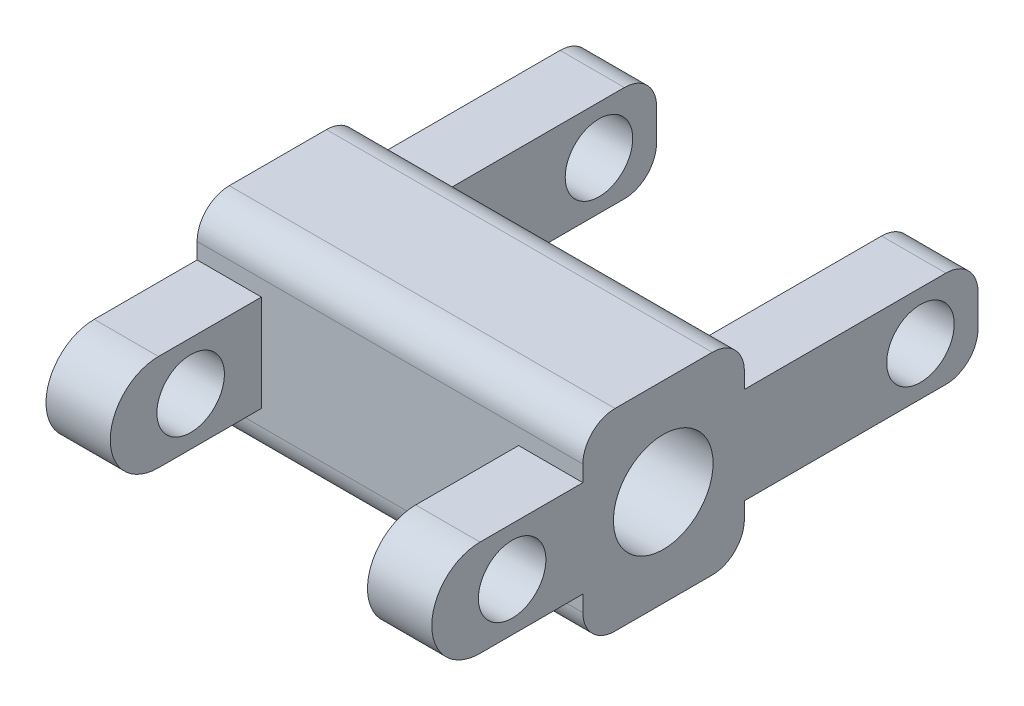
ISO-10303-21;
HEADER;
FILE_DESCRIPTION(('STEP AP214'),'2;1');
FILE_NAME('part.step','',(''),(''),'','','');
FILE_SCHEMA(('AUTOMOTIVE_DESIGN { 1 0 10303 214 1 1 1 1 }'));
ENDSEC;
DATA;
#1=APPLICATION_CONTEXT('core data for automotive mechanical design processes');
#2=APPLICATION_PROTOCOL_DEFINITION('international standard','automotive_design',2000,#1);
#3=PRODUCT_CONTEXT('',#1,'mechanical');
#4=PRODUCT('Part','Part','',(#3));
#5=PRODUCT_RELATED_PRODUCT_CATEGORY('part','',(#4));
#6=PRODUCT_DEFINITION_FORMATION('','',#4);
#7=PRODUCT_DEFINITION_CONTEXT('part definition',#1,'design');
#8=PRODUCT_DEFINITION('design','',#6,#7);
#9=PRODUCT_DEFINITION_SHAPE('','',#8);
#10=(LENGTH_UNIT() NAMED_UNIT(*) SI_UNIT(.MILLI.,.METRE.));
#11=(NAMED_UNIT(*) PLANE_ANGLE_UNIT() SI_UNIT($,.RADIAN.));
#12=(NAMED_UNIT(*) SI_UNIT($,.STERADIAN.) SOLID_ANGLE_UNIT());
#13=UNCERTAINTY_MEASURE_WITH_UNIT(LENGTH_MEASURE(1.E-05),#10,'distance_accuracy_value','');
#14=(GEOMETRIC_REPRESENTATION_CONTEXT(3) GLOBAL_UNCERTAINTY_ASSIGNED_CONTEXT((#13)) GLOBAL_UNIT_ASSIGNED_CONTEXT((#10,
#11,#12)) REPRESENTATION_CONTEXT('',''));
#15=CARTESIAN_POINT('',(0.,0.,0.));
#16=DIRECTION('',(0.,0.,1.));
#17=DIRECTION('',(1.,0.,0.));
#18=AXIS2_PLACEMENT_3D('',#15,#16,#17);
#19=CARTESIAN_POINT('',(0.,3.,0.));
#20=DIRECTION('',(0.,-1.,0.));
#21=DIRECTION('',(0.,0.,-1.));
#22=AXIS2_PLACEMENT_3D('',#19,#20,#21);
#23=PLANE('',#22);
#24=DIRECTION('',(1.,0.,0.));
#25=VECTOR('',#24,1.);
#26=CARTESIAN_POINT('',(-4.,3.,-2.77831175574415));
#27=LINE('',#26,#25);
#28=CARTESIAN_POINT('',(-4.,3.,-2.77831175574415));
#29=VERTEX_POINT('',#28);
#30=CARTESIAN_POINT('',(4.,3.,-2.77831175574415));
#31=VERTEX_POINT('',#30);
#32=EDGE_CURVE('E239',#29,#31,#27,.T.);
#33=ORIENTED_EDGE('',*,*,#32,.F.);
#34=DIRECTION('',(0.,0.,1.));
#35=VECTOR('',#34,1.);
#36=CARTESIAN_POINT('',(-4.,3.,-12.));
#37=LINE('',#36,#35);
#38=CARTESIAN_POINT('',(-4.,3.,-8.29020961255298));
#39=VERTEX_POINT('',#38);
#40=EDGE_CURVE('E222',#39,#29,#37,.T.);
#41=ORIENTED_EDGE('',*,*,#40,.F.);
#42=DIRECTION('',(1.,0.,0.));
#43=VECTOR('',#42,1.);
#44=CARTESIAN_POINT('',(0.,3.,-8.29020961255298));
#45=LINE('',#44,#43);
#46=CARTESIAN_POINT('',(-6.,3.,-8.29020961255298));
#47=VERTEX_POINT('',#46);
#48=EDGE_CURVE('E435',#39,#47,#45,.F.);
#49=ORIENTED_EDGE('',*,*,#48,.T.);
#50=DIRECTION('',(0.,0.,1.));
#51=VECTOR('',#50,1.);
#52=CARTESIAN_POINT('',(-6.,3.,0.));
#53=LINE('',#52,#51);
#54=CARTESIAN_POINT('',(-6.,3.,-2.02360737876782));
#55=VERTEX_POINT('',#54);
#56=EDGE_CURVE('E345',#47,#55,#53,.T.);
#57=ORIENTED_EDGE('',*,*,#56,.T.);
#58=DIRECTION('',(1.,0.,0.));
#59=VECTOR('',#58,1.);
#60=CARTESIAN_POINT('',(0.,3.,-2.02360737876782));
#61=LINE('',#60,#59);
#62=CARTESIAN_POINT('',(6.,3.,-2.02360737876782));
#63=VERTEX_POINT('',#62);
#64=EDGE_CURVE('E233',#55,#63,#61,.T.);
#65=ORIENTED_EDGE('',*,*,#64,.T.);
#66=DIRECTION('',(0.,0.,-1.));
#67=VECTOR('',#66,1.);
#68=CARTESIAN_POINT('',(6.,3.,8.7));
#69=LINE('',#68,#67);
#70=CARTESIAN_POINT('',(6.,3.,-8.29020961255298));
#71=VERTEX_POINT('',#70);
#72=EDGE_CURVE('E340',#63,#71,#69,.T.);
#73=ORIENTED_EDGE('',*,*,#72,.T.);
#74=DIRECTION('',(1.,0.,0.));
#75=VECTOR('',#74,1.);
#76=CARTESIAN_POINT('',(0.,3.,-8.29020961255298));
#77=LINE('',#76,#75);
#78=CARTESIAN_POINT('',(4.,3.,-8.29020961255298));
#79=VERTEX_POINT('',#78);
#80=EDGE_CURVE('E433',#71,#79,#77,.F.);
#81=ORIENTED_EDGE('',*,*,#80,.T.);
#82=DIRECTION('',(0.,0.,-1.));
#83=VECTOR('',#82,1.);
#84=CARTESIAN_POINT('',(4.,3.,-12.));
#85=LINE('',#84,#83);
#86=EDGE_CURVE('E232',#31,#79,#85,.T.);
#87=ORIENTED_EDGE('',*,*,#86,.F.);
#88=EDGE_LOOP('',(#33,#41,#49,#57,#65,#73,#81,#87));
#89=FACE_BOUND('',#88,.T.);
#90=ADVANCED_FACE('F35',(#89),#23,.F.);
#91=CARTESIAN_POINT('',(6.00000000000001,3.,6.2));
#92=VERTEX_POINT('',#91);
#93=CARTESIAN_POINT('',(6.,3.,3.));
#94=VERTEX_POINT('',#93);
#95=EDGE_CURVE('E341',#92,#94,#69,.T.);
#96=ORIENTED_EDGE('',*,*,#95,.T.);
#97=DIRECTION('',(-1.,0.,0.));
#98=VECTOR('',#97,1.);
#99=CARTESIAN_POINT('',(0.,3.,3.));
#100=LINE('',#99,#98);
#101=CARTESIAN_POINT('',(4.,3.,3.));
#102=VERTEX_POINT('',#101);
#103=EDGE_CURVE('E288',#94,#102,#100,.T.);
#104=ORIENTED_EDGE('',*,*,#103,.T.);
#105=DIRECTION('',(0.,0.,1.));
#106=VECTOR('',#105,1.);
#107=CARTESIAN_POINT('',(4.,3.,3.));
#108=LINE('',#107,#106);
#109=CARTESIAN_POINT('',(4.,3.,6.2));
#110=VERTEX_POINT('',#109);
#111=EDGE_CURVE('E336',#102,#110,#108,.T.);
#112=ORIENTED_EDGE('',*,*,#111,.T.);
#113=DIRECTION('',(-1.,0.,0.));
#114=VECTOR('',#113,1.);
#115=CARTESIAN_POINT('',(6.00000000000001,3.,6.2));
#116=LINE('',#115,#114);
#117=EDGE_CURVE('E327',#92,#110,#116,.T.);
#118=ORIENTED_EDGE('',*,*,#117,.F.);
#119=EDGE_LOOP('',(#96,#104,#112,#118));
#120=FACE_BOUND('',#119,.T.);
#121=ADVANCED_FACE('F528',(#120),#23,.F.);
#122=CARTESIAN_POINT('',(0.,0.,0.));
#123=DIRECTION('',(0.,-1.,0.));
#124=DIRECTION('',(0.,0.,-1.));
#125=AXIS2_PLACEMENT_3D('',#122,#123,#124);
#126=PLANE('',#125);
#127=DIRECTION('',(0.,0.,1.));
#128=VECTOR('',#127,1.);
#129=CARTESIAN_POINT('',(-4.,0.,-12.));
#130=LINE('',#129,#128);
#131=CARTESIAN_POINT('',(-4.,0.,-8.29020961255298));
#132=VERTEX_POINT('',#131);
#133=CARTESIAN_POINT('',(-4.,0.,-2.77831175574415));
#134=VERTEX_POINT('',#133);
#135=EDGE_CURVE('E297',#132,#134,#130,.T.);
#136=ORIENTED_EDGE('',*,*,#135,.T.);
#137=DIRECTION('',(-1.,0.,0.));
#138=VECTOR('',#137,1.);
#139=CARTESIAN_POINT('',(0.,0.,-2.77831175574415));
#140=LINE('',#139,#138);
#141=CARTESIAN_POINT('',(4.,0.,-2.77831175574415));
#142=VERTEX_POINT('',#141);
#143=EDGE_CURVE('E12',#142,#134,#140,.T.);
#144=ORIENTED_EDGE('',*,*,#143,.F.);
#145=DIRECTION('',(0.,0.,-1.));
#146=VECTOR('',#145,1.);
#147=CARTESIAN_POINT('',(4.,0.,-12.));
#148=LINE('',#147,#146);
#149=CARTESIAN_POINT('',(4.,0.,-8.29020961255298));
#150=VERTEX_POINT('',#149);
#151=EDGE_CURVE('E293',#142,#150,#148,.T.);
#152=ORIENTED_EDGE('',*,*,#151,.T.);
#153=DIRECTION('',(1.,0.,0.));
#154=VECTOR('',#153,1.);
#155=CARTESIAN_POINT('',(6.,0.,-8.29020961255298));
#156=LINE('',#155,#154);
#157=CARTESIAN_POINT('',(6.,0.,-8.29020961255298));
#158=VERTEX_POINT('',#157);
#159=EDGE_CURVE('E415',#150,#158,#156,.T.);
#160=ORIENTED_EDGE('',*,*,#159,.T.);
#161=DIRECTION('',(0.,0.,-1.));
#162=VECTOR('',#161,1.);
#163=CARTESIAN_POINT('',(6.,0.,8.7));
#164=LINE('',#163,#162);
#165=CARTESIAN_POINT('',(6.,0.,-2.02360737876782));
#166=VERTEX_POINT('',#165);
#167=EDGE_CURVE('E353',#166,#158,#164,.T.);
#168=ORIENTED_EDGE('',*,*,#167,.F.);
#169=DIRECTION('',(1.,0.,0.));
#170=VECTOR('',#169,1.);
#171=CARTESIAN_POINT('',(0.,0.,-2.02360737876782));
#172=LINE('',#171,#170);
#173=CARTESIAN_POINT('',(-6.,0.,-2.02360737876782));
#174=VERTEX_POINT('',#173);
#175=EDGE_CURVE('E374',#174,#166,#172,.T.);
#176=ORIENTED_EDGE('',*,*,#175,.F.);
#177=DIRECTION('',(0.,0.,1.));
#178=VECTOR('',#177,1.);
#179=CARTESIAN_POINT('',(-6.,0.,0.));
#180=LINE('',#179,#178);
#181=CARTESIAN_POINT('',(-6.,0.,-8.29020961255298));
#182=VERTEX_POINT('',#181);
#183=EDGE_CURVE('E337',#182,#174,#180,.T.);
#184=ORIENTED_EDGE('',*,*,#183,.F.);
#185=DIRECTION('',(1.,0.,0.));
#186=VECTOR('',#185,1.);
#187=CARTESIAN_POINT('',(-4.,0.,-8.29020961255298));
#188=LINE('',#187,#186);
#189=EDGE_CURVE('E418',#182,#132,#188,.T.);
#190=ORIENTED_EDGE('',*,*,#189,.T.);
#191=EDGE_LOOP('',(#136,#144,#152,#160,#168,#176,#184,#190));
#192=FACE_BOUND('',#191,.T.);
#193=ADVANCED_FACE('F450',(#192),#126,.T.);
#194=DIRECTION('',(-1.,0.,0.));
#195=VECTOR('',#194,1.);
#196=CARTESIAN_POINT('',(0.,0.,3.));
#197=LINE('',#196,#195);
#198=CARTESIAN_POINT('',(6.,0.,3.));
#199=VERTEX_POINT('',#198);
#200=CARTESIAN_POINT('',(4.,0.,3.));
#201=VERTEX_POINT('',#200);
#202=EDGE_CURVE('E373',#199,#201,#197,.T.);
#203=ORIENTED_EDGE('',*,*,#202,.F.);
#204=CARTESIAN_POINT('',(6.00000000000001,0.,6.2));
#205=VERTEX_POINT('',#204);
#206=EDGE_CURVE('E354',#205,#199,#164,.T.);
#207=ORIENTED_EDGE('',*,*,#206,.F.);
#208=DIRECTION('',(-1.,0.,0.));
#209=VECTOR('',#208,1.);
#210=CARTESIAN_POINT('',(6.00000000000001,0.,6.2));
#211=LINE('',#210,#209);
#212=CARTESIAN_POINT('',(4.,0.,6.2));
#213=VERTEX_POINT('',#212);
#214=EDGE_CURVE('E323',#205,#213,#211,.T.);
#215=ORIENTED_EDGE('',*,*,#214,.T.);
#216=DIRECTION('',(0.,0.,1.));
#217=VECTOR('',#216,1.);
#218=CARTESIAN_POINT('',(4.,0.,3.));
#219=LINE('',#218,#217);
#220=EDGE_CURVE('E350',#201,#213,#219,.T.);
#221=ORIENTED_EDGE('',*,*,#220,.F.);
#222=EDGE_LOOP('',(#203,#207,#215,#221));
#223=FACE_BOUND('',#222,.T.);
#224=ADVANCED_FACE('F539',(#223),#126,.T.);
#225=CARTESIAN_POINT('',(-4.,3.,8.7));
#226=DIRECTION('',(-1.,0.,0.));
#227=DIRECTION('',(0.,0.,1.));
#228=AXIS2_PLACEMENT_3D('',#225,#226,#227);
#229=PLANE('',#228);
#230=CARTESIAN_POINT('',(-4.,1.5,5.2));
#231=DIRECTION('',(-1.,0.,0.));
#232=DIRECTION('',(0.,0.,1.));
#233=AXIS2_PLACEMENT_3D('',#230,#231,#232);
#234=CIRCLE('',#233,1.05);
#235=CARTESIAN_POINT('',(-4.,1.5,6.25));
#236=VERTEX_POINT('',#235);
#237=EDGE_CURVE('E314',#236,#236,#234,.T.);
#238=ORIENTED_EDGE('',*,*,#237,.T.);
#239=EDGE_LOOP('',(#238));
#240=FACE_BOUND('',#239,.T.);
#241=CARTESIAN_POINT('',(-4.,1.5,6.2));
#242=DIRECTION('',(-1.,0.,0.));
#243=DIRECTION('',(0.,0.,1.));
#244=AXIS2_PLACEMENT_3D('',#241,#242,#243);
#245=CIRCLE('',#244,1.5);
#246=CARTESIAN_POINT('',(-4.,0.,6.2));
#247=VERTEX_POINT('',#246);
#248=CARTESIAN_POINT('',(-4.,3.,6.2));
#249=VERTEX_POINT('',#248);
#250=EDGE_CURVE('E330',#247,#249,#245,.T.);
#251=ORIENTED_EDGE('',*,*,#250,.F.);
#252=DIRECTION('',(0.,0.,-1.));
#253=VECTOR('',#252,1.);
#254=CARTESIAN_POINT('',(-4.,0.,8.7));
#255=LINE('',#254,#253);
#256=CARTESIAN_POINT('',(-4.,0.,3.));
#257=VERTEX_POINT('',#256);
#258=EDGE_CURVE('E332',#247,#257,#255,.T.);
#259=ORIENTED_EDGE('',*,*,#258,.T.);
#260=DIRECTION('',(0.,-1.,0.));
#261=VECTOR('',#260,1.);
#262=CARTESIAN_POINT('',(-4.,3.,3.));
#263=LINE('',#262,#261);
#264=CARTESIAN_POINT('',(-4.,3.,3.));
#265=VERTEX_POINT('',#264);
#266=EDGE_CURVE('E360',#265,#257,#263,.T.);
#267=ORIENTED_EDGE('',*,*,#266,.F.);
#268=DIRECTION('',(0.,0.,-1.));
#269=VECTOR('',#268,1.);
#270=CARTESIAN_POINT('',(-4.,3.,8.7));
#271=LINE('',#270,#269);
#272=EDGE_CURVE('E333',#249,#265,#271,.T.);
#273=ORIENTED_EDGE('',*,*,#272,.F.);
#274=EDGE_LOOP('',(#251,#259,#267,#273));
#275=FACE_BOUND('',#274,.T.);
#276=ADVANCED_FACE('F505',(#240,#275),#229,.F.);
#277=CARTESIAN_POINT('',(4.,3.,3.));
#278=DIRECTION('',(1.,0.,0.));
#279=DIRECTION('',(0.,0.,-1.));
#280=AXIS2_PLACEMENT_3D('',#277,#278,#279);
#281=PLANE('',#280);
#282=CARTESIAN_POINT('',(4.,1.5,5.2));
#283=DIRECTION('',(1.,0.,0.));
#284=DIRECTION('',(0.,0.,-1.));
#285=AXIS2_PLACEMENT_3D('',#282,#283,#284);
#286=CIRCLE('',#285,1.05);
#287=CARTESIAN_POINT('',(4.,1.5,4.15));
#288=VERTEX_POINT('',#287);
#289=EDGE_CURVE('E309',#288,#288,#286,.T.);
#290=ORIENTED_EDGE('',*,*,#289,.T.);
#291=EDGE_LOOP('',(#290));
#292=FACE_BOUND('',#291,.T.);
#293=CARTESIAN_POINT('',(4.,1.5,6.2));
#294=DIRECTION('',(1.,0.,0.));
#295=DIRECTION('',(0.,0.,-1.));
#296=AXIS2_PLACEMENT_3D('',#293,#294,#295);
#297=CIRCLE('',#296,1.5);
#298=EDGE_CURVE('E326',#110,#213,#297,.T.);
#299=ORIENTED_EDGE('',*,*,#298,.F.);
#300=ORIENTED_EDGE('',*,*,#111,.F.);
#301=DIRECTION('',(0.,-1.,0.));
#302=VECTOR('',#301,1.);
#303=CARTESIAN_POINT('',(4.,3.,3.));
#304=LINE('',#303,#302);
#305=EDGE_CURVE('E347',#102,#201,#304,.T.);
#306=ORIENTED_EDGE('',*,*,#305,.T.);
#307=ORIENTED_EDGE('',*,*,#220,.T.);
#308=EDGE_LOOP('',(#299,#300,#306,#307));
#309=FACE_BOUND('',#308,.T.);
#310=ADVANCED_FACE('F545',(#292,#309),#281,.F.);
#311=CARTESIAN_POINT('',(6.,3.,8.7));
#312=DIRECTION('',(-1.,0.,0.));
#313=DIRECTION('',(0.,0.,1.));
#314=AXIS2_PLACEMENT_3D('',#311,#312,#313);
#315=PLANE('',#314);
#316=CARTESIAN_POINT('',(6.,1.5,0.499999999999997));
#317=DIRECTION('',(1.,0.,0.));
#318=DIRECTION('',(0.,0.,-1.));
#319=AXIS2_PLACEMENT_3D('',#316,#317,#318);
#320=CIRCLE('',#319,1.55);
#321=CARTESIAN_POINT('',(6.,1.5,-1.05));
#322=VERTEX_POINT('',#321);
#323=EDGE_CURVE('E254',#322,#322,#320,.T.);
#324=ORIENTED_EDGE('',*,*,#323,.F.);
#325=EDGE_LOOP('',(#324));
#326=FACE_BOUND('',#325,.T.);
#327=CARTESIAN_POINT('',(6.,1.5,5.2));
#328=DIRECTION('',(-1.,0.,0.));
#329=DIRECTION('',(0.,0.,1.));
#330=AXIS2_PLACEMENT_3D('',#327,#328,#329);
#331=CIRCLE('',#330,1.05);
#332=CARTESIAN_POINT('',(6.,1.5,6.25));
#333=VERTEX_POINT('',#332);
#334=EDGE_CURVE('E306',#333,#333,#331,.T.);
#335=ORIENTED_EDGE('',*,*,#334,.T.);
#336=EDGE_LOOP('',(#335));
#337=FACE_BOUND('',#336,.T.);
#338=ORIENTED_EDGE('',*,*,#167,.T.);
#339=CARTESIAN_POINT('',(6.,1.,-8.29020961255298));
#340=DIRECTION('',(-1.,0.,0.));
#341=DIRECTION('',(0.,0.,1.));
#342=AXIS2_PLACEMENT_3D('',#339,#340,#341);
#343=CIRCLE('',#342,1.);
#344=CARTESIAN_POINT('',(6.,1.,-9.29020961255298));
#345=VERTEX_POINT('',#344);
#346=EDGE_CURVE('E439',#158,#345,#343,.F.);
#347=ORIENTED_EDGE('',*,*,#346,.T.);
#348=DIRECTION('',(0.,-1.,0.));
#349=VECTOR('',#348,1.);
#350=CARTESIAN_POINT('',(6.,3.,-9.29020961255298));
#351=LINE('',#350,#349);
#352=CARTESIAN_POINT('',(6.,2.,-9.29020961255298));
#353=VERTEX_POINT('',#352);
#354=EDGE_CURVE('E246',#353,#345,#351,.T.);
#355=ORIENTED_EDGE('',*,*,#354,.F.);
#356=CARTESIAN_POINT('',(6.,2.,-8.29020961255298));
#357=DIRECTION('',(-1.,0.,0.));
#358=DIRECTION('',(0.,0.,1.));
#359=AXIS2_PLACEMENT_3D('',#356,#357,#358);
#360=CIRCLE('',#359,1.);
#361=EDGE_CURVE('E437',#353,#71,#360,.F.);
#362=ORIENTED_EDGE('',*,*,#361,.T.);
#363=ORIENTED_EDGE('',*,*,#72,.F.);
#364=DIRECTION('',(0.,1.,0.));
#365=VECTOR('',#364,1.);
#366=CARTESIAN_POINT('',(6.,-1.5,-2.02360737876782));
#367=LINE('',#366,#365);
#368=CARTESIAN_POINT('',(6.,3.5,-2.02360737876782));
#369=VERTEX_POINT('',#368);
#370=EDGE_CURVE('E280',#63,#369,#367,.T.);
#371=ORIENTED_EDGE('',*,*,#370,.T.);
#372=CARTESIAN_POINT('',(6.,3.5,-1.02360737876782));
#373=DIRECTION('',(-1.,0.,0.));
#374=DIRECTION('',(0.,0.,1.));
#375=AXIS2_PLACEMENT_3D('',#372,#373,#374);
#376=CIRCLE('',#375,1.);
#377=CARTESIAN_POINT('',(6.,4.5,-1.02360737876782));
#378=VERTEX_POINT('',#377);
#379=EDGE_CURVE('E399',#369,#378,#376,.F.);
#380=ORIENTED_EDGE('',*,*,#379,.T.);
#381=DIRECTION('',(0.,0.,-1.));
#382=VECTOR('',#381,1.);
#383=CARTESIAN_POINT('',(6.,4.5,3.));
#384=LINE('',#383,#382);
#385=CARTESIAN_POINT('',(6.,4.5,2.));
#386=VERTEX_POINT('',#385);
#387=EDGE_CURVE('E265',#386,#378,#384,.T.);
#388=ORIENTED_EDGE('',*,*,#387,.F.);
#389=CARTESIAN_POINT('',(6.,3.5,2.));
#390=DIRECTION('',(-1.,0.,0.));
#391=DIRECTION('',(0.,0.,1.));
#392=AXIS2_PLACEMENT_3D('',#389,#390,#391);
#393=CIRCLE('',#392,1.);
#394=CARTESIAN_POINT('',(6.,3.5,3.));
#395=VERTEX_POINT('',#394);
#396=EDGE_CURVE('E397',#386,#395,#393,.F.);
#397=ORIENTED_EDGE('',*,*,#396,.T.);
#398=DIRECTION('',(0.,1.,0.));
#399=VECTOR('',#398,1.);
#400=CARTESIAN_POINT('',(6.,-1.5,3.));
#401=LINE('',#400,#399);
#402=EDGE_CURVE('E283',#94,#395,#401,.T.);
#403=ORIENTED_EDGE('',*,*,#402,.F.);
#404=ORIENTED_EDGE('',*,*,#95,.F.);
#405=CARTESIAN_POINT('',(6.00000000000001,1.5,6.2));
#406=DIRECTION('',(-1.,0.,0.));
#407=DIRECTION('',(0.,0.,1.));
#408=AXIS2_PLACEMENT_3D('',#405,#406,#407);
#409=CIRCLE('',#408,1.5);
#410=EDGE_CURVE('E318',#205,#92,#409,.T.);
#411=ORIENTED_EDGE('',*,*,#410,.F.);
#412=ORIENTED_EDGE('',*,*,#206,.T.);
#413=CARTESIAN_POINT('',(6.,-0.5,3.));
#414=VERTEX_POINT('',#413);
#415=EDGE_CURVE('E281',#414,#199,#401,.T.);
#416=ORIENTED_EDGE('',*,*,#415,.F.);
#417=CARTESIAN_POINT('',(6.,-0.5,2.));
#418=DIRECTION('',(-1.,0.,0.));
#419=DIRECTION('',(0.,0.,1.));
#420=AXIS2_PLACEMENT_3D('',#417,#418,#419);
#421=CIRCLE('',#420,1.);
#422=CARTESIAN_POINT('',(6.,-1.5,2.));
#423=VERTEX_POINT('',#422);
#424=EDGE_CURVE('E395',#414,#423,#421,.F.);
#425=ORIENTED_EDGE('',*,*,#424,.T.);
#426=DIRECTION('',(0.,0.,-1.));
#427=VECTOR('',#426,1.);
#428=CARTESIAN_POINT('',(6.,-1.5,3.));
#429=LINE('',#428,#427);
#430=CARTESIAN_POINT('',(6.,-1.5,-1.02360737876782));
#431=VERTEX_POINT('',#430);
#432=EDGE_CURVE('E264',#423,#431,#429,.T.);
#433=ORIENTED_EDGE('',*,*,#432,.T.);
#434=CARTESIAN_POINT('',(6.,-0.5,-1.02360737876782));
#435=DIRECTION('',(-1.,0.,0.));
#436=DIRECTION('',(0.,0.,1.));
#437=AXIS2_PLACEMENT_3D('',#434,#435,#436);
#438=CIRCLE('',#437,1.);
#439=CARTESIAN_POINT('',(6.,-0.5,-2.02360737876782));
#440=VERTEX_POINT('',#439);
#441=EDGE_CURVE('E393',#431,#440,#438,.F.);
#442=ORIENTED_EDGE('',*,*,#441,.T.);
#443=EDGE_CURVE('E278',#440,#166,#367,.T.);
#444=ORIENTED_EDGE('',*,*,#443,.T.);
#445=EDGE_LOOP('',(#338,#347,#355,#362,#363,#371,#380,#388,#397,#403,#404,#411,#412,#416,#425,
#433,#442,#444));
#446=FACE_BOUND('',#445,.T.);
#447=CARTESIAN_POINT('',(6.,1.5,-7.5));
#448=DIRECTION('',(1.,0.,0.));
#449=DIRECTION('',(0.,0.,-1.));
#450=AXIS2_PLACEMENT_3D('',#447,#448,#449);
#451=CIRCLE('',#450,1.05);
#452=CARTESIAN_POINT('',(6.,1.5,-8.55));
#453=VERTEX_POINT('',#452);
#454=EDGE_CURVE('E299',#453,#453,#451,.T.);
#455=ORIENTED_EDGE('',*,*,#454,.F.);
#456=EDGE_LOOP('',(#455));
#457=FACE_BOUND('',#456,.T.);
#458=ADVANCED_FACE('F456',(#326,#337,#446,#457),#315,.F.);
#459=CARTESIAN_POINT('',(-6.,3.,0.));
#460=DIRECTION('',(1.,0.,0.));
#461=DIRECTION('',(0.,0.,-1.));
#462=AXIS2_PLACEMENT_3D('',#459,#460,#461);
#463=PLANE('',#462);
#464=CARTESIAN_POINT('',(-6.00000000000001,1.5,0.499999999999999));
#465=DIRECTION('',(1.,0.,0.));
#466=DIRECTION('',(0.,0.,-1.));
#467=AXIS2_PLACEMENT_3D('',#464,#465,#466);
#468=CIRCLE('',#467,1.55);
#469=CARTESIAN_POINT('',(-6.00000000000001,1.5,-1.05));
#470=VERTEX_POINT('',#469);
#471=EDGE_CURVE('E255',#470,#470,#468,.T.);
#472=ORIENTED_EDGE('',*,*,#471,.T.);
#473=EDGE_LOOP('',(#472));
#474=FACE_BOUND('',#473,.T.);
#475=CARTESIAN_POINT('',(-6.,1.5,5.2));
#476=DIRECTION('',(-1.,0.,0.));
#477=DIRECTION('',(0.,0.,1.));
#478=AXIS2_PLACEMENT_3D('',#475,#476,#477);
#479=CIRCLE('',#478,1.05);
#480=CARTESIAN_POINT('',(-6.,1.5,6.25));
#481=VERTEX_POINT('',#480);
#482=EDGE_CURVE('E303',#481,#481,#479,.T.);
#483=ORIENTED_EDGE('',*,*,#482,.F.);
#484=EDGE_LOOP('',(#483));
#485=FACE_BOUND('',#484,.T.);
#486=DIRECTION('',(0.,-1.,0.));
#487=VECTOR('',#486,1.);
#488=CARTESIAN_POINT('',(-6.00000000000001,3.,-9.29020961255298));
#489=LINE('',#488,#487);
#490=CARTESIAN_POINT('',(-6.00000000000001,2.,-9.29020961255298));
#491=VERTEX_POINT('',#490);
#492=CARTESIAN_POINT('',(-6.00000000000001,1.,-9.29020961255298));
#493=VERTEX_POINT('',#492);
#494=EDGE_CURVE('E248',#491,#493,#489,.T.);
#495=ORIENTED_EDGE('',*,*,#494,.T.);
#496=CARTESIAN_POINT('',(-6.,1.,-8.29020961255298));
#497=DIRECTION('',(1.,0.,0.));
#498=DIRECTION('',(0.,0.,-1.));
#499=AXIS2_PLACEMENT_3D('',#496,#497,#498);
#500=CIRCLE('',#499,1.);
#501=EDGE_CURVE('E431',#493,#182,#500,.F.);
#502=ORIENTED_EDGE('',*,*,#501,.T.);
#503=ORIENTED_EDGE('',*,*,#183,.T.);
#504=DIRECTION('',(0.,1.,0.));
#505=VECTOR('',#504,1.);
#506=CARTESIAN_POINT('',(-6.,-1.5,-2.02360737876782));
#507=LINE('',#506,#505);
#508=CARTESIAN_POINT('',(-6.,-0.5,-2.02360737876782));
#509=VERTEX_POINT('',#508);
#510=EDGE_CURVE('E273',#509,#174,#507,.T.);
#511=ORIENTED_EDGE('',*,*,#510,.F.);
#512=CARTESIAN_POINT('',(-6.,-0.5,-1.02360737876782));
#513=DIRECTION('',(1.,0.,0.));
#514=DIRECTION('',(0.,0.,-1.));
#515=AXIS2_PLACEMENT_3D('',#512,#513,#514);
#516=CIRCLE('',#515,1.);
#517=CARTESIAN_POINT('',(-6.,-1.5,-1.02360737876782));
#518=VERTEX_POINT('',#517);
#519=EDGE_CURVE('E383',#509,#518,#516,.F.);
#520=ORIENTED_EDGE('',*,*,#519,.T.);
#521=DIRECTION('',(0.,0.,1.));
#522=VECTOR('',#521,1.);
#523=CARTESIAN_POINT('',(-6.,-1.5,-2.02360737876782));
#524=LINE('',#523,#522);
#525=CARTESIAN_POINT('',(-6.,-1.5,2.));
#526=VERTEX_POINT('',#525);
#527=EDGE_CURVE('E261',#518,#526,#524,.T.);
#528=ORIENTED_EDGE('',*,*,#527,.T.);
#529=CARTESIAN_POINT('',(-6.,-0.5,2.));
#530=DIRECTION('',(1.,0.,0.));
#531=DIRECTION('',(0.,0.,-1.));
#532=AXIS2_PLACEMENT_3D('',#529,#530,#531);
#533=CIRCLE('',#532,1.);
#534=CARTESIAN_POINT('',(-6.,-0.5,3.));
#535=VERTEX_POINT('',#534);
#536=EDGE_CURVE('E385',#526,#535,#533,.F.);
#537=ORIENTED_EDGE('',*,*,#536,.T.);
#538=DIRECTION('',(0.,1.,0.));
#539=VECTOR('',#538,1.);
#540=CARTESIAN_POINT('',(-6.,-1.5,3.));
#541=LINE('',#540,#539);
#542=CARTESIAN_POINT('',(-6.,0.,3.));
#543=VERTEX_POINT('',#542);
#544=EDGE_CURVE('E284',#535,#543,#541,.T.);
#545=ORIENTED_EDGE('',*,*,#544,.T.);
#546=CARTESIAN_POINT('',(-6.,0.,6.2));
#547=VERTEX_POINT('',#546);
#548=EDGE_CURVE('E357',#543,#547,#180,.T.);
#549=ORIENTED_EDGE('',*,*,#548,.T.);
#550=CARTESIAN_POINT('',(-6.,1.5,6.2));
#551=DIRECTION('',(-1.,0.,0.));
#552=DIRECTION('',(0.,0.,1.));
#553=AXIS2_PLACEMENT_3D('',#550,#551,#552);
#554=CIRCLE('',#553,1.5);
#555=CARTESIAN_POINT('',(-6.,3.,6.2));
#556=VERTEX_POINT('',#555);
#557=EDGE_CURVE('E317',#547,#556,#554,.T.);
#558=ORIENTED_EDGE('',*,*,#557,.T.);
#559=CARTESIAN_POINT('',(-6.,3.,3.));
#560=VERTEX_POINT('',#559);
#561=EDGE_CURVE('E344',#560,#556,#53,.T.);
#562=ORIENTED_EDGE('',*,*,#561,.F.);
#563=CARTESIAN_POINT('',(-6.,3.5,3.));
#564=VERTEX_POINT('',#563);
#565=EDGE_CURVE('E268',#560,#564,#541,.T.);
#566=ORIENTED_EDGE('',*,*,#565,.T.);
#567=CARTESIAN_POINT('',(-6.,3.5,2.));
#568=DIRECTION('',(1.,0.,0.));
#569=DIRECTION('',(0.,0.,-1.));
#570=AXIS2_PLACEMENT_3D('',#567,#568,#569);
#571=CIRCLE('',#570,1.);
#572=CARTESIAN_POINT('',(-6.,4.5,2.));
#573=VERTEX_POINT('',#572);
#574=EDGE_CURVE('E387',#564,#573,#571,.F.);
#575=ORIENTED_EDGE('',*,*,#574,.T.);
#576=DIRECTION('',(0.,0.,1.));
#577=VECTOR('',#576,1.);
#578=CARTESIAN_POINT('',(-6.,4.5,-2.02360737876782));
#579=LINE('',#578,#577);
#580=CARTESIAN_POINT('',(-6.,4.5,-1.02360737876782));
#581=VERTEX_POINT('',#580);
#582=EDGE_CURVE('E258',#581,#573,#579,.T.);
#583=ORIENTED_EDGE('',*,*,#582,.F.);
#584=CARTESIAN_POINT('',(-6.,3.5,-1.02360737876782));
#585=DIRECTION('',(1.,0.,0.));
#586=DIRECTION('',(0.,0.,-1.));
#587=AXIS2_PLACEMENT_3D('',#584,#585,#586);
#588=CIRCLE('',#587,1.);
#589=CARTESIAN_POINT('',(-6.,3.5,-2.02360737876782));
#590=VERTEX_POINT('',#589);
#591=EDGE_CURVE('E389',#581,#590,#588,.F.);
#592=ORIENTED_EDGE('',*,*,#591,.T.);
#593=EDGE_CURVE('E277',#55,#590,#507,.T.);
#594=ORIENTED_EDGE('',*,*,#593,.F.);
#595=ORIENTED_EDGE('',*,*,#56,.F.);
#596=CARTESIAN_POINT('',(-6.,2.,-8.29020961255298));
#597=DIRECTION('',(1.,0.,0.));
#598=DIRECTION('',(0.,0.,-1.));
#599=AXIS2_PLACEMENT_3D('',#596,#597,#598);
#600=CIRCLE('',#599,1.);
#601=EDGE_CURVE('E429',#47,#491,#600,.F.);
#602=ORIENTED_EDGE('',*,*,#601,.T.);
#603=EDGE_LOOP('',(#495,#502,#503,#511,#520,#528,#537,#545,#549,#558,#562,#566,#575,#583,#592,
#594,#595,#602));
#604=FACE_BOUND('',#603,.T.);
#605=CARTESIAN_POINT('',(-6.,1.5,-7.5));
#606=DIRECTION('',(1.,0.,0.));
#607=DIRECTION('',(0.,0.,-1.));
#608=AXIS2_PLACEMENT_3D('',#605,#606,#607);
#609=CIRCLE('',#608,1.05);
#610=CARTESIAN_POINT('',(-6.,1.5,-8.55));
#611=VERTEX_POINT('',#610);
#612=EDGE_CURVE('E300',#611,#611,#609,.T.);
#613=ORIENTED_EDGE('',*,*,#612,.T.);
#614=EDGE_LOOP('',(#613));
#615=FACE_BOUND('',#614,.T.);
#616=ADVANCED_FACE('F473',(#474,#485,#604,#615),#463,.F.);
#617=ORIENTED_EDGE('',*,*,#272,.T.);
#618=EDGE_CURVE('E276',#265,#560,#100,.T.);
#619=ORIENTED_EDGE('',*,*,#618,.T.);
#620=ORIENTED_EDGE('',*,*,#561,.T.);
#621=EDGE_CURVE('E320',#249,#556,#116,.T.);
#622=ORIENTED_EDGE('',*,*,#621,.F.);
#623=EDGE_LOOP('',(#617,#619,#620,#622));
#624=FACE_BOUND('',#623,.T.);
#625=ADVANCED_FACE('F498',(#624),#23,.F.);
#626=EDGE_CURVE('E366',#257,#543,#197,.T.);
#627=ORIENTED_EDGE('',*,*,#626,.F.);
#628=ORIENTED_EDGE('',*,*,#258,.F.);
#629=DIRECTION('',(-1.,0.,0.));
#630=VECTOR('',#629,1.);
#631=CARTESIAN_POINT('',(6.00000000000001,0.,6.2));
#632=LINE('',#631,#630);
#633=EDGE_CURVE('E363',#247,#547,#632,.T.);
#634=ORIENTED_EDGE('',*,*,#633,.T.);
#635=ORIENTED_EDGE('',*,*,#548,.F.);
#636=EDGE_LOOP('',(#627,#628,#634,#635));
#637=FACE_BOUND('',#636,.T.);
#638=ADVANCED_FACE('F511',(#637),#126,.T.);
#639=CARTESIAN_POINT('',(-4.,3.,3.));
#640=DIRECTION('',(0.,0.,-1.));
#641=DIRECTION('',(-1.,0.,0.));
#642=AXIS2_PLACEMENT_3D('',#639,#640,#641);
#643=PLANE('',#642);
#644=ORIENTED_EDGE('',*,*,#402,.T.);
#645=DIRECTION('',(1.,0.,0.));
#646=VECTOR('',#645,1.);
#647=CARTESIAN_POINT('',(-6.,3.5,3.));
#648=LINE('',#647,#646);
#649=EDGE_CURVE('E404',#395,#564,#648,.F.);
#650=ORIENTED_EDGE('',*,*,#649,.T.);
#651=ORIENTED_EDGE('',*,*,#565,.F.);
#652=ORIENTED_EDGE('',*,*,#618,.F.);
#653=ORIENTED_EDGE('',*,*,#266,.T.);
#654=ORIENTED_EDGE('',*,*,#626,.T.);
#655=ORIENTED_EDGE('',*,*,#544,.F.);
#656=DIRECTION('',(1.,0.,0.));
#657=VECTOR('',#656,1.);
#658=CARTESIAN_POINT('',(-4.,-0.5,3.));
#659=LINE('',#658,#657);
#660=EDGE_CURVE('E401',#535,#414,#659,.T.);
#661=ORIENTED_EDGE('',*,*,#660,.T.);
#662=ORIENTED_EDGE('',*,*,#415,.T.);
#663=ORIENTED_EDGE('',*,*,#202,.T.);
#664=ORIENTED_EDGE('',*,*,#305,.F.);
#665=ORIENTED_EDGE('',*,*,#103,.F.);
#666=EDGE_LOOP('',(#644,#650,#651,#652,#653,#654,#655,#661,#662,#663,#664,#665));
#667=FACE_BOUND('',#666,.T.);
#668=ADVANCED_FACE('F491',(#667),#643,.F.);
#669=CARTESIAN_POINT('',(6.00000000000001,1.5,6.2));
#670=DIRECTION('',(-1.,0.,0.));
#671=DIRECTION('',(0.,0.,1.));
#672=AXIS2_PLACEMENT_3D('',#669,#670,#671);
#673=CYLINDRICAL_SURFACE('',#672,1.5);
#674=ORIENTED_EDGE('',*,*,#250,.T.);
#675=ORIENTED_EDGE('',*,*,#621,.T.);
#676=ORIENTED_EDGE('',*,*,#557,.F.);
#677=ORIENTED_EDGE('',*,*,#633,.F.);
#678=EDGE_LOOP('',(#674,#675,#676,#677));
#679=FACE_BOUND('',#678,.T.);
#680=ADVANCED_FACE('F514',(#679),#673,.T.);
#681=ORIENTED_EDGE('',*,*,#298,.T.);
#682=ORIENTED_EDGE('',*,*,#214,.F.);
#683=ORIENTED_EDGE('',*,*,#410,.T.);
#684=ORIENTED_EDGE('',*,*,#117,.T.);
#685=EDGE_LOOP('',(#681,#682,#683,#684));
#686=FACE_BOUND('',#685,.T.);
#687=ADVANCED_FACE('F516',(#686),#673,.T.);
#688=CARTESIAN_POINT('',(6.,1.5,5.2));
#689=DIRECTION('',(-1.,0.,0.));
#690=DIRECTION('',(0.,0.,1.));
#691=AXIS2_PLACEMENT_3D('',#688,#689,#690);
#692=CYLINDRICAL_SURFACE('',#691,1.05);
#693=ORIENTED_EDGE('',*,*,#482,.T.);
#694=EDGE_LOOP('',(#693));
#695=FACE_BOUND('',#694,.T.);
#696=ORIENTED_EDGE('',*,*,#237,.F.);
#697=EDGE_LOOP('',(#696));
#698=FACE_BOUND('',#697,.T.);
#699=ADVANCED_FACE('F522',(#695,#698),#692,.F.);
#700=ORIENTED_EDGE('',*,*,#334,.F.);
#701=EDGE_LOOP('',(#700));
#702=FACE_BOUND('',#701,.T.);
#703=ORIENTED_EDGE('',*,*,#289,.F.);
#704=EDGE_LOOP('',(#703));
#705=FACE_BOUND('',#704,.T.);
#706=ADVANCED_FACE('F614',(#702,#705),#692,.F.);
#707=CARTESIAN_POINT('',(-6.,1.5,-7.5));
#708=DIRECTION('',(1.,0.,0.));
#709=DIRECTION('',(0.,0.,-1.));
#710=AXIS2_PLACEMENT_3D('',#707,#708,#709);
#711=CYLINDRICAL_SURFACE('',#710,1.05);
#712=CARTESIAN_POINT('',(-4.,1.5,-7.5));
#713=DIRECTION('',(-1.,0.,0.));
#714=DIRECTION('',(0.,0.,1.));
#715=AXIS2_PLACEMENT_3D('',#712,#713,#714);
#716=CIRCLE('',#715,1.05);
#717=CARTESIAN_POINT('',(-4.,1.5,-6.45));
#718=VERTEX_POINT('',#717);
#719=EDGE_CURVE('E296',#718,#718,#716,.F.);
#720=ORIENTED_EDGE('',*,*,#719,.T.);
#721=EDGE_LOOP('',(#720));
#722=FACE_BOUND('',#721,.T.);
#723=ORIENTED_EDGE('',*,*,#612,.F.);
#724=EDGE_LOOP('',(#723));
#725=FACE_BOUND('',#724,.T.);
#726=ADVANCED_FACE('F611',(#722,#725),#711,.F.);
#727=CARTESIAN_POINT('',(4.,1.5,-7.5));
#728=DIRECTION('',(1.,0.,0.));
#729=DIRECTION('',(0.,0.,-1.));
#730=AXIS2_PLACEMENT_3D('',#727,#728,#729);
#731=CIRCLE('',#730,1.05);
#732=CARTESIAN_POINT('',(4.,1.5,-8.55));
#733=VERTEX_POINT('',#732);
#734=EDGE_CURVE('E292',#733,#733,#731,.F.);
#735=ORIENTED_EDGE('',*,*,#734,.T.);
#736=EDGE_LOOP('',(#735));
#737=FACE_BOUND('',#736,.T.);
#738=ORIENTED_EDGE('',*,*,#454,.T.);
#739=EDGE_LOOP('',(#738));
#740=FACE_BOUND('',#739,.T.);
#741=ADVANCED_FACE('F605',(#737,#740),#711,.F.);
#742=CARTESIAN_POINT('',(4.,-5.,-12.));
#743=DIRECTION('',(1.,0.,0.));
#744=DIRECTION('',(0.,0.,-1.));
#745=AXIS2_PLACEMENT_3D('',#742,#743,#744);
#746=PLANE('',#745);
#747=ORIENTED_EDGE('',*,*,#734,.F.);
#748=EDGE_LOOP('',(#747));
#749=FACE_BOUND('',#748,.T.);
#750=DIRECTION('',(0.,-1.,0.));
#751=VECTOR('',#750,1.);
#752=CARTESIAN_POINT('',(4.,-5.,-9.29020961255298));
#753=LINE('',#752,#751);
#754=CARTESIAN_POINT('',(4.,2.,-9.29020961255298));
#755=VERTEX_POINT('',#754);
#756=CARTESIAN_POINT('',(4.,1.,-9.29020961255298));
#757=VERTEX_POINT('',#756);
#758=EDGE_CURVE('E251',#755,#757,#753,.T.);
#759=ORIENTED_EDGE('',*,*,#758,.T.);
#760=CARTESIAN_POINT('',(4.,1.,-8.29020961255298));
#761=DIRECTION('',(1.,0.,0.));
#762=DIRECTION('',(0.,0.,-1.));
#763=AXIS2_PLACEMENT_3D('',#760,#761,#762);
#764=CIRCLE('',#763,1.);
#765=EDGE_CURVE('E43',#757,#150,#764,.F.);
#766=ORIENTED_EDGE('',*,*,#765,.T.);
#767=ORIENTED_EDGE('',*,*,#151,.F.);
#768=DIRECTION('',(0.,1.,0.));
#769=VECTOR('',#768,1.);
#770=CARTESIAN_POINT('',(4.,-1.5,-2.77831175574415));
#771=LINE('',#770,#769);
#772=EDGE_CURVE('E241',#142,#31,#771,.T.);
#773=ORIENTED_EDGE('',*,*,#772,.T.);
#774=ORIENTED_EDGE('',*,*,#86,.T.);
#775=CARTESIAN_POINT('',(4.,2.,-8.29020961255298));
#776=DIRECTION('',(1.,0.,0.));
#777=DIRECTION('',(0.,0.,-1.));
#778=AXIS2_PLACEMENT_3D('',#775,#776,#777);
#779=CIRCLE('',#778,1.);
#780=EDGE_CURVE('E57',#79,#755,#779,.F.);
#781=ORIENTED_EDGE('',*,*,#780,.T.);
#782=EDGE_LOOP('',(#759,#766,#767,#773,#774,#781));
#783=FACE_BOUND('',#782,.T.);
#784=ADVANCED_FACE('F446',(#749,#783),#746,.F.);
#785=CARTESIAN_POINT('',(-4.,-5.,-12.));
#786=DIRECTION('',(-1.,0.,0.));
#787=DIRECTION('',(0.,0.,1.));
#788=AXIS2_PLACEMENT_3D('',#785,#786,#787);
#789=PLANE('',#788);
#790=ORIENTED_EDGE('',*,*,#719,.F.);
#791=EDGE_LOOP('',(#790));
#792=FACE_BOUND('',#791,.T.);
#793=ORIENTED_EDGE('',*,*,#135,.F.);
#794=CARTESIAN_POINT('',(-4.,1.,-8.29020961255298));
#795=DIRECTION('',(-1.,0.,0.));
#796=DIRECTION('',(0.,0.,1.));
#797=AXIS2_PLACEMENT_3D('',#794,#795,#796);
#798=CIRCLE('',#797,1.);
#799=CARTESIAN_POINT('',(-4.,1.,-9.29020961255298));
#800=VERTEX_POINT('',#799);
#801=EDGE_CURVE('E422',#132,#800,#798,.F.);
#802=ORIENTED_EDGE('',*,*,#801,.T.);
#803=DIRECTION('',(0.,1.,0.));
#804=VECTOR('',#803,1.);
#805=CARTESIAN_POINT('',(-4.,-5.,-9.29020961255298));
#806=LINE('',#805,#804);
#807=CARTESIAN_POINT('',(-4.,2.,-9.29020961255298));
#808=VERTEX_POINT('',#807);
#809=EDGE_CURVE('E413',#800,#808,#806,.T.);
#810=ORIENTED_EDGE('',*,*,#809,.T.);
#811=CARTESIAN_POINT('',(-4.,2.,-8.29020961255298));
#812=DIRECTION('',(-1.,0.,0.));
#813=DIRECTION('',(0.,0.,1.));
#814=AXIS2_PLACEMENT_3D('',#811,#812,#813);
#815=CIRCLE('',#814,1.);
#816=EDGE_CURVE('E228',#808,#39,#815,.F.);
#817=ORIENTED_EDGE('',*,*,#816,.T.);
#818=ORIENTED_EDGE('',*,*,#40,.T.);
#819=DIRECTION('',(0.,1.,0.));
#820=VECTOR('',#819,1.);
#821=CARTESIAN_POINT('',(-4.,-1.5,-2.77831175574415));
#822=LINE('',#821,#820);
#823=EDGE_CURVE('E226',#134,#29,#822,.T.);
#824=ORIENTED_EDGE('',*,*,#823,.F.);
#825=EDGE_LOOP('',(#793,#802,#810,#817,#818,#824));
#826=FACE_BOUND('',#825,.T.);
#827=ADVANCED_FACE('F225',(#792,#826),#789,.F.);
#828=CARTESIAN_POINT('',(0.,-1.5,0.));
#829=DIRECTION('',(0.,1.,0.));
#830=DIRECTION('',(0.,0.,1.));
#831=AXIS2_PLACEMENT_3D('',#828,#829,#830);
#832=PLANE('',#831);
#833=ORIENTED_EDGE('',*,*,#432,.F.);
#834=DIRECTION('',(1.,0.,0.));
#835=VECTOR('',#834,1.);
#836=CARTESIAN_POINT('',(0.,-1.5,2.));
#837=LINE('',#836,#835);
#838=EDGE_CURVE('E408',#423,#526,#837,.F.);
#839=ORIENTED_EDGE('',*,*,#838,.T.);
#840=ORIENTED_EDGE('',*,*,#527,.F.);
#841=DIRECTION('',(-1.,0.,0.));
#842=VECTOR('',#841,1.);
#843=CARTESIAN_POINT('',(6.,-1.5,-1.02360737876782));
#844=LINE('',#843,#842);
#845=EDGE_CURVE('E406',#518,#431,#844,.F.);
#846=ORIENTED_EDGE('',*,*,#845,.T.);
#847=EDGE_LOOP('',(#833,#839,#840,#846));
#848=FACE_BOUND('',#847,.T.);
#849=ADVANCED_FACE('F593',(#848),#832,.F.);
#850=CARTESIAN_POINT('',(6.,-1.5,-2.02360737876782));
#851=DIRECTION('',(0.,0.,-1.));
#852=DIRECTION('',(-1.,0.,0.));
#853=AXIS2_PLACEMENT_3D('',#850,#851,#852);
#854=PLANE('',#853);
#855=ORIENTED_EDGE('',*,*,#443,.F.);
#856=DIRECTION('',(-1.,0.,0.));
#857=VECTOR('',#856,1.);
#858=CARTESIAN_POINT('',(-6.,-0.5,-2.02360737876782));
#859=LINE('',#858,#857);
#860=EDGE_CURVE('E410',#440,#509,#859,.T.);
#861=ORIENTED_EDGE('',*,*,#860,.T.);
#862=ORIENTED_EDGE('',*,*,#510,.T.);
#863=ORIENTED_EDGE('',*,*,#175,.T.);
#864=EDGE_LOOP('',(#855,#861,#862,#863));
#865=FACE_BOUND('',#864,.T.);
#866=ADVANCED_FACE('F596',(#865),#854,.T.);
#867=ORIENTED_EDGE('',*,*,#593,.T.);
#868=DIRECTION('',(-1.,0.,0.));
#869=VECTOR('',#868,1.);
#870=CARTESIAN_POINT('',(6.,3.5,-2.02360737876782));
#871=LINE('',#870,#869);
#872=EDGE_CURVE('E391',#590,#369,#871,.F.);
#873=ORIENTED_EDGE('',*,*,#872,.T.);
#874=ORIENTED_EDGE('',*,*,#370,.F.);
#875=ORIENTED_EDGE('',*,*,#64,.F.);
#876=EDGE_LOOP('',(#867,#873,#874,#875));
#877=FACE_BOUND('',#876,.T.);
#878=ADVANCED_FACE('F470',(#877),#854,.T.);
#879=CARTESIAN_POINT('',(0.,4.5,0.));
#880=DIRECTION('',(0.,1.,0.));
#881=DIRECTION('',(0.,0.,1.));
#882=AXIS2_PLACEMENT_3D('',#879,#880,#881);
#883=PLANE('',#882);
#884=ORIENTED_EDGE('',*,*,#387,.T.);
#885=DIRECTION('',(-1.,0.,0.));
#886=VECTOR('',#885,1.);
#887=CARTESIAN_POINT('',(0.,4.5,-1.02360737876782));
#888=LINE('',#887,#886);
#889=EDGE_CURVE('E380',#378,#581,#888,.T.);
#890=ORIENTED_EDGE('',*,*,#889,.T.);
#891=ORIENTED_EDGE('',*,*,#582,.T.);
#892=DIRECTION('',(1.,0.,0.));
#893=VECTOR('',#892,1.);
#894=CARTESIAN_POINT('',(6.,4.5,2.));
#895=LINE('',#894,#893);
#896=EDGE_CURVE('E377',#573,#386,#895,.T.);
#897=ORIENTED_EDGE('',*,*,#896,.T.);
#898=EDGE_LOOP('',(#884,#890,#891,#897));
#899=FACE_BOUND('',#898,.T.);
#900=ADVANCED_FACE('F482',(#899),#883,.T.);
#901=CARTESIAN_POINT('',(-6.00000000000001,1.5,0.499999999999999));
#902=DIRECTION('',(1.,0.,0.));
#903=DIRECTION('',(0.,0.,-1.));
#904=AXIS2_PLACEMENT_3D('',#901,#902,#903);
#905=CYLINDRICAL_SURFACE('',#904,1.55);
#906=ORIENTED_EDGE('',*,*,#471,.F.);
#907=EDGE_LOOP('',(#906));
#908=FACE_BOUND('',#907,.T.);
#909=ORIENTED_EDGE('',*,*,#323,.T.);
#910=EDGE_LOOP('',(#909));
#911=FACE_BOUND('',#910,.T.);
#912=ADVANCED_FACE('F558',(#908,#911),#905,.F.);
#913=CARTESIAN_POINT('',(0.,3.5,-1.02360737876782));
#914=DIRECTION('',(-1.,0.,0.));
#915=DIRECTION('',(0.,0.,1.));
#916=AXIS2_PLACEMENT_3D('',#913,#914,#915);
#917=CYLINDRICAL_SURFACE('',#916,1.);
#918=ORIENTED_EDGE('',*,*,#379,.F.);
#919=ORIENTED_EDGE('',*,*,#872,.F.);
#920=ORIENTED_EDGE('',*,*,#591,.F.);
#921=ORIENTED_EDGE('',*,*,#889,.F.);
#922=EDGE_LOOP('',(#918,#919,#920,#921));
#923=FACE_BOUND('',#922,.T.);
#924=ADVANCED_FACE('F480',(#923),#917,.T.);
#925=CARTESIAN_POINT('',(0.,3.5,2.));
#926=DIRECTION('',(-1.,0.,0.));
#927=DIRECTION('',(0.,0.,1.));
#928=AXIS2_PLACEMENT_3D('',#925,#926,#927);
#929=CYLINDRICAL_SURFACE('',#928,1.);
#930=ORIENTED_EDGE('',*,*,#574,.F.);
#931=ORIENTED_EDGE('',*,*,#649,.F.);
#932=ORIENTED_EDGE('',*,*,#396,.F.);
#933=ORIENTED_EDGE('',*,*,#896,.F.);
#934=EDGE_LOOP('',(#930,#931,#932,#933));
#935=FACE_BOUND('',#934,.T.);
#936=ADVANCED_FACE('F495',(#935),#929,.T.);
#937=CARTESIAN_POINT('',(-4.,-0.5,2.));
#938=DIRECTION('',(1.,0.,0.));
#939=DIRECTION('',(0.,0.,-1.));
#940=AXIS2_PLACEMENT_3D('',#937,#938,#939);
#941=CYLINDRICAL_SURFACE('',#940,1.);
#942=ORIENTED_EDGE('',*,*,#536,.F.);
#943=ORIENTED_EDGE('',*,*,#838,.F.);
#944=ORIENTED_EDGE('',*,*,#424,.F.);
#945=ORIENTED_EDGE('',*,*,#660,.F.);
#946=EDGE_LOOP('',(#942,#943,#944,#945));
#947=FACE_BOUND('',#946,.T.);
#948=ADVANCED_FACE('F561',(#947),#941,.T.);
#949=CARTESIAN_POINT('',(6.,-0.5,-1.02360737876782));
#950=DIRECTION('',(1.,0.,0.));
#951=DIRECTION('',(0.,0.,-1.));
#952=AXIS2_PLACEMENT_3D('',#949,#950,#951);
#953=CYLINDRICAL_SURFACE('',#952,1.);
#954=ORIENTED_EDGE('',*,*,#441,.F.);
#955=ORIENTED_EDGE('',*,*,#845,.F.);
#956=ORIENTED_EDGE('',*,*,#519,.F.);
#957=ORIENTED_EDGE('',*,*,#860,.F.);
#958=EDGE_LOOP('',(#954,#955,#956,#957));
#959=FACE_BOUND('',#958,.T.);
#960=ADVANCED_FACE('F564',(#959),#953,.T.);
#961=CARTESIAN_POINT('',(-6.00000000000001,3.,-9.29020961255298));
#962=DIRECTION('',(0.,0.,1.));
#963=DIRECTION('',(1.,0.,0.));
#964=AXIS2_PLACEMENT_3D('',#961,#962,#963);
#965=PLANE('',#964);
#966=ORIENTED_EDGE('',*,*,#809,.F.);
#967=DIRECTION('',(1.,0.,0.));
#968=VECTOR('',#967,1.);
#969=CARTESIAN_POINT('',(-6.00000000000001,1.,-9.29020961255298));
#970=LINE('',#969,#968);
#971=EDGE_CURVE('E427',#800,#493,#970,.F.);
#972=ORIENTED_EDGE('',*,*,#971,.T.);
#973=ORIENTED_EDGE('',*,*,#494,.F.);
#974=DIRECTION('',(1.,0.,0.));
#975=VECTOR('',#974,1.);
#976=CARTESIAN_POINT('',(-6.00000000000001,2.,-9.29020961255298));
#977=LINE('',#976,#975);
#978=EDGE_CURVE('E424',#491,#808,#977,.T.);
#979=ORIENTED_EDGE('',*,*,#978,.T.);
#980=EDGE_LOOP('',(#966,#972,#973,#979));
#981=FACE_BOUND('',#980,.T.);
#982=ADVANCED_FACE('F568',(#981),#965,.F.);
#983=ORIENTED_EDGE('',*,*,#354,.T.);
#984=DIRECTION('',(1.,0.,0.));
#985=VECTOR('',#984,1.);
#986=CARTESIAN_POINT('',(4.,1.,-9.29020961255298));
#987=LINE('',#986,#985);
#988=EDGE_CURVE('E50',#345,#757,#987,.F.);
#989=ORIENTED_EDGE('',*,*,#988,.T.);
#990=ORIENTED_EDGE('',*,*,#758,.F.);
#991=DIRECTION('',(1.,0.,0.));
#992=VECTOR('',#991,1.);
#993=CARTESIAN_POINT('',(-6.00000000000001,2.,-9.29020961255298));
#994=LINE('',#993,#992);
#995=EDGE_CURVE('E441',#755,#353,#994,.T.);
#996=ORIENTED_EDGE('',*,*,#995,.T.);
#997=EDGE_LOOP('',(#983,#989,#990,#996));
#998=FACE_BOUND('',#997,.T.);
#999=ADVANCED_FACE('F458',(#998),#965,.F.);
#1000=CARTESIAN_POINT('',(0.,1.,-8.29020961255298));
#1001=DIRECTION('',(-1.,0.,0.));
#1002=DIRECTION('',(0.,0.,1.));
#1003=AXIS2_PLACEMENT_3D('',#1000,#1001,#1002);
#1004=CYLINDRICAL_SURFACE('',#1003,1.);
#1005=ORIENTED_EDGE('',*,*,#501,.F.);
#1006=ORIENTED_EDGE('',*,*,#971,.F.);
#1007=ORIENTED_EDGE('',*,*,#801,.F.);
#1008=ORIENTED_EDGE('',*,*,#189,.F.);
#1009=EDGE_LOOP('',(#1005,#1006,#1007,#1008));
#1010=FACE_BOUND('',#1009,.T.);
#1011=ADVANCED_FACE('F570',(#1010),#1004,.T.);
#1012=CARTESIAN_POINT('',(-6.00000000000001,2.,-8.29020961255298));
#1013=DIRECTION('',(1.,0.,0.));
#1014=DIRECTION('',(0.,0.,-1.));
#1015=AXIS2_PLACEMENT_3D('',#1012,#1013,#1014);
#1016=CYLINDRICAL_SURFACE('',#1015,1.);
#1017=ORIENTED_EDGE('',*,*,#601,.F.);
#1018=ORIENTED_EDGE('',*,*,#48,.F.);
#1019=ORIENTED_EDGE('',*,*,#816,.F.);
#1020=ORIENTED_EDGE('',*,*,#978,.F.);
#1021=EDGE_LOOP('',(#1017,#1018,#1019,#1020));
#1022=FACE_BOUND('',#1021,.T.);
#1023=ADVANCED_FACE('F573',(#1022),#1016,.T.);
#1024=CARTESIAN_POINT('',(0.,1.,-8.29020961255298));
#1025=DIRECTION('',(-1.,0.,0.));
#1026=DIRECTION('',(0.,0.,1.));
#1027=AXIS2_PLACEMENT_3D('',#1024,#1025,#1026);
#1028=CYLINDRICAL_SURFACE('',#1027,1.);
#1029=ORIENTED_EDGE('',*,*,#765,.F.);
#1030=ORIENTED_EDGE('',*,*,#988,.F.);
#1031=ORIENTED_EDGE('',*,*,#346,.F.);
#1032=ORIENTED_EDGE('',*,*,#159,.F.);
#1033=EDGE_LOOP('',(#1029,#1030,#1031,#1032));
#1034=FACE_BOUND('',#1033,.T.);
#1035=ADVANCED_FACE('F453',(#1034),#1028,.T.);
#1036=CARTESIAN_POINT('',(-6.00000000000001,2.,-8.29020961255298));
#1037=DIRECTION('',(1.,0.,0.));
#1038=DIRECTION('',(0.,0.,-1.));
#1039=AXIS2_PLACEMENT_3D('',#1036,#1037,#1038);
#1040=CYLINDRICAL_SURFACE('',#1039,1.);
#1041=ORIENTED_EDGE('',*,*,#780,.F.);
#1042=ORIENTED_EDGE('',*,*,#80,.F.);
#1043=ORIENTED_EDGE('',*,*,#361,.F.);
#1044=ORIENTED_EDGE('',*,*,#995,.F.);
#1045=EDGE_LOOP('',(#1041,#1042,#1043,#1044));
#1046=FACE_BOUND('',#1045,.T.);
#1047=ADVANCED_FACE('F37',(#1046),#1040,.T.);
#1048=CARTESIAN_POINT('',(-4.,-1.5,-2.77831175574415));
#1049=DIRECTION('',(0.,0.,1.));
#1050=DIRECTION('',(1.,0.,0.));
#1051=AXIS2_PLACEMENT_3D('',#1048,#1049,#1050);
#1052=PLANE('',#1051);
#1053=ORIENTED_EDGE('',*,*,#143,.T.);
#1054=ORIENTED_EDGE('',*,*,#823,.T.);
#1055=ORIENTED_EDGE('',*,*,#32,.T.);
#1056=ORIENTED_EDGE('',*,*,#772,.F.);
#1057=EDGE_LOOP('',(#1053,#1054,#1055,#1056));
#1058=FACE_BOUND('',#1057,.T.);
#1059=ADVANCED_FACE('F237',(#1058),#1052,.F.);
#1060=CLOSED_SHELL('',(#90,#121,#193,#224,#276,#310,#458,#616,#625,#638,#668,#680,#687,#699,
#706,#726,#741,#784,#827,#849,#866,#878,#900,#912,#924,#936,#948,#960,#982,#999,#1011,#1023,
#1035,#1047,#1059));
#1061=MANIFOLD_SOLID_BREP('B2',#1060);
#1062=ADVANCED_BREP_SHAPE_REPRESENTATION('',(#18,#1061),#14);
#1063=SHAPE_DEFINITION_REPRESENTATION(#9,#1062);
ENDSEC;
END-ISO-10303-21;
